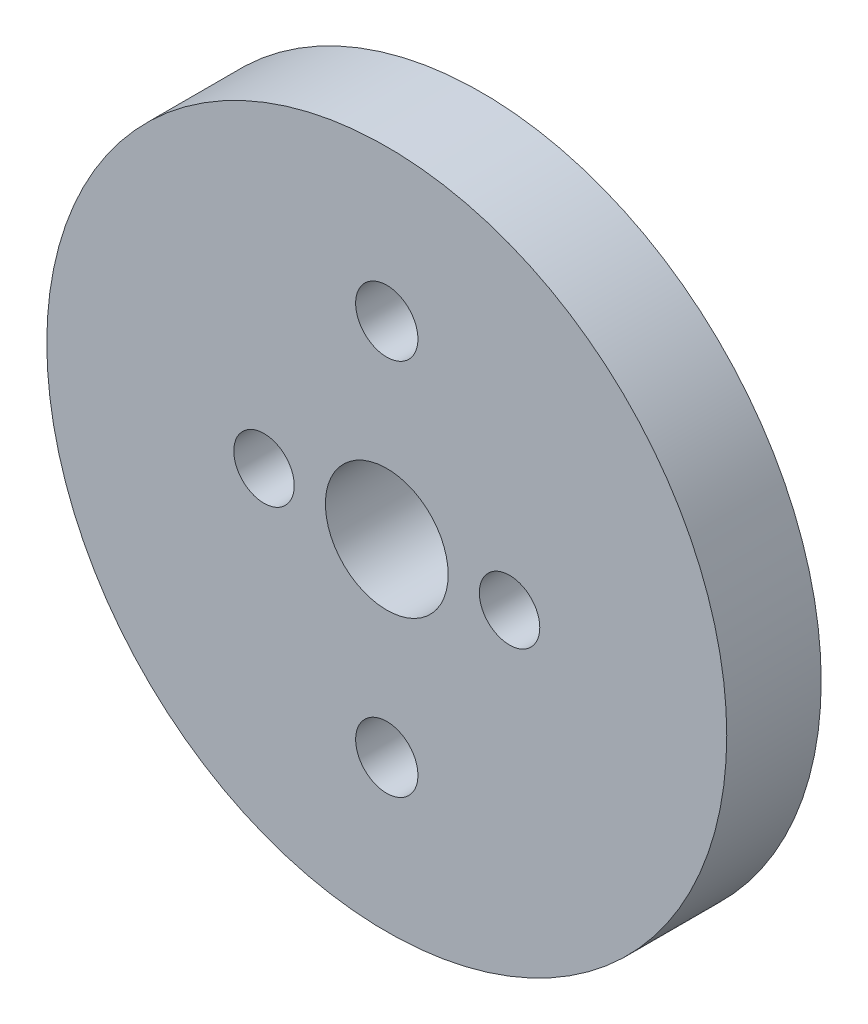
ISO-10303-21;
HEADER;
FILE_DESCRIPTION(('STEP AP214'),'2;1');
FILE_NAME('part.step','',(''),(''),'','','');
FILE_SCHEMA(('AUTOMOTIVE_DESIGN { 1 0 10303 214 1 1 1 1 }'));
ENDSEC;
DATA;
#1=APPLICATION_CONTEXT('core data for automotive mechanical design processes');
#2=APPLICATION_PROTOCOL_DEFINITION('international standard','automotive_design',2000,#1);
#3=PRODUCT_CONTEXT('',#1,'mechanical');
#4=PRODUCT('Part','Part','',(#3));
#5=PRODUCT_RELATED_PRODUCT_CATEGORY('part','',(#4));
#6=PRODUCT_DEFINITION_FORMATION('','',#4);
#7=PRODUCT_DEFINITION_CONTEXT('part definition',#1,'design');
#8=PRODUCT_DEFINITION('design','',#6,#7);
#9=PRODUCT_DEFINITION_SHAPE('','',#8);
#10=(LENGTH_UNIT() NAMED_UNIT(*) SI_UNIT(.MILLI.,.METRE.));
#11=(NAMED_UNIT(*) PLANE_ANGLE_UNIT() SI_UNIT($,.RADIAN.));
#12=(NAMED_UNIT(*) SI_UNIT($,.STERADIAN.) SOLID_ANGLE_UNIT());
#13=UNCERTAINTY_MEASURE_WITH_UNIT(LENGTH_MEASURE(1.E-05),#10,'distance_accuracy_value','');
#14=(GEOMETRIC_REPRESENTATION_CONTEXT(3) GLOBAL_UNCERTAINTY_ASSIGNED_CONTEXT((#13)) GLOBAL_UNIT_ASSIGNED_CONTEXT((#10,
#11,#12)) REPRESENTATION_CONTEXT('',''));
#15=CARTESIAN_POINT('',(0.,0.,0.));
#16=DIRECTION('',(0.,0.,1.));
#17=DIRECTION('',(1.,0.,0.));
#18=AXIS2_PLACEMENT_3D('',#15,#16,#17);
#19=CARTESIAN_POINT('',(0.,0.,5.));
#20=DIRECTION('',(0.,0.,1.));
#21=DIRECTION('',(1.,0.,0.));
#22=AXIS2_PLACEMENT_3D('',#19,#20,#21);
#23=PLANE('',#22);
#24=CARTESIAN_POINT('',(0.,10.,5.));
#25=DIRECTION('',(0.,0.,1.));
#26=DIRECTION('',(1.,0.,0.));
#27=AXIS2_PLACEMENT_3D('',#24,#25,#26);
#28=CIRCLE('',#27,1.65);
#29=CARTESIAN_POINT('',(1.65,10.,5.));
#30=VERTEX_POINT('',#29);
#31=EDGE_CURVE('E72',#30,#30,#28,.T.);
#32=ORIENTED_EDGE('',*,*,#31,.F.);
#33=EDGE_LOOP('',(#32));
#34=FACE_BOUND('',#33,.T.);
#35=CARTESIAN_POINT('',(0.,-10.,5.));
#36=DIRECTION('',(0.,0.,1.));
#37=DIRECTION('',(-1.,0.,0.));
#38=AXIS2_PLACEMENT_3D('',#35,#36,#37);
#39=CIRCLE('',#38,1.65);
#40=CARTESIAN_POINT('',(-1.65,-10.,5.));
#41=VERTEX_POINT('',#40);
#42=EDGE_CURVE('E66',#41,#41,#39,.T.);
#43=ORIENTED_EDGE('',*,*,#42,.F.);
#44=EDGE_LOOP('',(#43));
#45=FACE_BOUND('',#44,.T.);
#46=CARTESIAN_POINT('',(6.5,0.,5.));
#47=DIRECTION('',(0.,0.,1.));
#48=DIRECTION('',(1.,0.,0.));
#49=AXIS2_PLACEMENT_3D('',#46,#47,#48);
#50=CIRCLE('',#49,1.6);
#51=CARTESIAN_POINT('',(8.1,0.,5.));
#52=VERTEX_POINT('',#51);
#53=EDGE_CURVE('E51',#52,#52,#50,.T.);
#54=ORIENTED_EDGE('',*,*,#53,.F.);
#55=EDGE_LOOP('',(#54));
#56=FACE_BOUND('',#55,.T.);
#57=CARTESIAN_POINT('',(0.,0.,5.));
#58=DIRECTION('',(0.,0.,1.));
#59=DIRECTION('',(1.,0.,0.));
#60=AXIS2_PLACEMENT_3D('',#57,#58,#59);
#61=CIRCLE('',#60,18.);
#62=CARTESIAN_POINT('',(18.,0.,5.));
#63=VERTEX_POINT('',#62);
#64=EDGE_CURVE('E10',#63,#63,#61,.T.);
#65=ORIENTED_EDGE('',*,*,#64,.T.);
#66=EDGE_LOOP('',(#65));
#67=FACE_BOUND('',#66,.T.);
#68=CARTESIAN_POINT('',(0.,0.,5.));
#69=DIRECTION('',(0.,0.,1.));
#70=DIRECTION('',(1.,0.,0.));
#71=AXIS2_PLACEMENT_3D('',#68,#69,#70);
#72=CIRCLE('',#71,3.25);
#73=CARTESIAN_POINT('',(3.25,0.,5.));
#74=VERTEX_POINT('',#73);
#75=EDGE_CURVE('E46',#74,#74,#72,.T.);
#76=ORIENTED_EDGE('',*,*,#75,.F.);
#77=EDGE_LOOP('',(#76));
#78=FACE_BOUND('',#77,.T.);
#79=CARTESIAN_POINT('',(-6.5,0.,5.));
#80=DIRECTION('',(0.,0.,1.));
#81=DIRECTION('',(-1.,0.,0.));
#82=AXIS2_PLACEMENT_3D('',#79,#80,#81);
#83=CIRCLE('',#82,1.6);
#84=CARTESIAN_POINT('',(-8.1,0.,5.));
#85=VERTEX_POINT('',#84);
#86=EDGE_CURVE('E57',#85,#85,#83,.T.);
#87=ORIENTED_EDGE('',*,*,#86,.F.);
#88=EDGE_LOOP('',(#87));
#89=FACE_BOUND('',#88,.T.);
#90=ADVANCED_FACE('F35',(#34,#45,#56,#67,#78,#89),#23,.T.);
#91=CARTESIAN_POINT('',(0.,0.,0.));
#92=DIRECTION('',(0.,0.,1.));
#93=DIRECTION('',(1.,0.,0.));
#94=AXIS2_PLACEMENT_3D('',#91,#92,#93);
#95=PLANE('',#94);
#96=CARTESIAN_POINT('',(0.,10.,0.));
#97=DIRECTION('',(0.,0.,1.));
#98=DIRECTION('',(1.,0.,0.));
#99=AXIS2_PLACEMENT_3D('',#96,#97,#98);
#100=CIRCLE('',#99,1.65);
#101=CARTESIAN_POINT('',(1.65,10.,0.));
#102=VERTEX_POINT('',#101);
#103=EDGE_CURVE('E63',#102,#102,#100,.T.);
#104=ORIENTED_EDGE('',*,*,#103,.T.);
#105=EDGE_LOOP('',(#104));
#106=FACE_BOUND('',#105,.T.);
#107=CARTESIAN_POINT('',(0.,-10.,0.));
#108=DIRECTION('',(0.,0.,1.));
#109=DIRECTION('',(-1.,0.,0.));
#110=AXIS2_PLACEMENT_3D('',#107,#108,#109);
#111=CIRCLE('',#110,1.65);
#112=CARTESIAN_POINT('',(-1.65,-10.,0.));
#113=VERTEX_POINT('',#112);
#114=EDGE_CURVE('E69',#113,#113,#111,.T.);
#115=ORIENTED_EDGE('',*,*,#114,.T.);
#116=EDGE_LOOP('',(#115));
#117=FACE_BOUND('',#116,.T.);
#118=CARTESIAN_POINT('',(0.,0.,0.));
#119=DIRECTION('',(0.,0.,1.));
#120=DIRECTION('',(1.,0.,0.));
#121=AXIS2_PLACEMENT_3D('',#118,#119,#120);
#122=CIRCLE('',#121,18.);
#123=CARTESIAN_POINT('',(18.,0.,0.));
#124=VERTEX_POINT('',#123);
#125=EDGE_CURVE('E39',#124,#124,#122,.T.);
#126=ORIENTED_EDGE('',*,*,#125,.F.);
#127=EDGE_LOOP('',(#126));
#128=FACE_BOUND('',#127,.T.);
#129=CARTESIAN_POINT('',(0.,0.,0.));
#130=DIRECTION('',(0.,0.,1.));
#131=DIRECTION('',(1.,0.,0.));
#132=AXIS2_PLACEMENT_3D('',#129,#130,#131);
#133=CIRCLE('',#132,3.25);
#134=CARTESIAN_POINT('',(3.25,0.,0.));
#135=VERTEX_POINT('',#134);
#136=EDGE_CURVE('E48',#135,#135,#133,.T.);
#137=ORIENTED_EDGE('',*,*,#136,.T.);
#138=EDGE_LOOP('',(#137));
#139=FACE_BOUND('',#138,.T.);
#140=CARTESIAN_POINT('',(6.5,0.,0.));
#141=DIRECTION('',(0.,0.,1.));
#142=DIRECTION('',(1.,0.,0.));
#143=AXIS2_PLACEMENT_3D('',#140,#141,#142);
#144=CIRCLE('',#143,1.6);
#145=CARTESIAN_POINT('',(8.1,0.,0.));
#146=VERTEX_POINT('',#145);
#147=EDGE_CURVE('E54',#146,#146,#144,.T.);
#148=ORIENTED_EDGE('',*,*,#147,.T.);
#149=EDGE_LOOP('',(#148));
#150=FACE_BOUND('',#149,.T.);
#151=CARTESIAN_POINT('',(-6.5,0.,0.));
#152=DIRECTION('',(0.,0.,1.));
#153=DIRECTION('',(-1.,0.,0.));
#154=AXIS2_PLACEMENT_3D('',#151,#152,#153);
#155=CIRCLE('',#154,1.6);
#156=CARTESIAN_POINT('',(-8.1,0.,0.));
#157=VERTEX_POINT('',#156);
#158=EDGE_CURVE('E60',#157,#157,#155,.T.);
#159=ORIENTED_EDGE('',*,*,#158,.T.);
#160=EDGE_LOOP('',(#159));
#161=FACE_BOUND('',#160,.T.);
#162=ADVANCED_FACE('F78',(#106,#117,#128,#139,#150,#161),#95,.F.);
#163=CARTESIAN_POINT('',(0.,0.,5.));
#164=DIRECTION('',(0.,0.,-1.));
#165=DIRECTION('',(-1.,0.,0.));
#166=AXIS2_PLACEMENT_3D('',#163,#164,#165);
#167=CYLINDRICAL_SURFACE('',#166,18.);
#168=ORIENTED_EDGE('',*,*,#64,.F.);
#169=EDGE_LOOP('',(#168));
#170=FACE_BOUND('',#169,.T.);
#171=ORIENTED_EDGE('',*,*,#125,.T.);
#172=EDGE_LOOP('',(#171));
#173=FACE_BOUND('',#172,.T.);
#174=ADVANCED_FACE('F37',(#170,#173),#167,.T.);
#175=CARTESIAN_POINT('',(0.,0.,5.));
#176=DIRECTION('',(0.,0.,-1.));
#177=DIRECTION('',(-1.,0.,0.));
#178=AXIS2_PLACEMENT_3D('',#175,#176,#177);
#179=CYLINDRICAL_SURFACE('',#178,3.25);
#180=ORIENTED_EDGE('',*,*,#75,.T.);
#181=EDGE_LOOP('',(#180));
#182=FACE_BOUND('',#181,.T.);
#183=ORIENTED_EDGE('',*,*,#136,.F.);
#184=EDGE_LOOP('',(#183));
#185=FACE_BOUND('',#184,.T.);
#186=ADVANCED_FACE('F110',(#182,#185),#179,.F.);
#187=CARTESIAN_POINT('',(6.5,0.,5.));
#188=DIRECTION('',(0.,0.,-1.));
#189=DIRECTION('',(-1.,0.,0.));
#190=AXIS2_PLACEMENT_3D('',#187,#188,#189);
#191=CYLINDRICAL_SURFACE('',#190,1.6);
#192=ORIENTED_EDGE('',*,*,#53,.T.);
#193=EDGE_LOOP('',(#192));
#194=FACE_BOUND('',#193,.T.);
#195=ORIENTED_EDGE('',*,*,#147,.F.);
#196=EDGE_LOOP('',(#195));
#197=FACE_BOUND('',#196,.T.);
#198=ADVANCED_FACE('F102',(#194,#197),#191,.F.);
#199=CARTESIAN_POINT('',(-6.5,0.,5.));
#200=DIRECTION('',(0.,0.,-1.));
#201=DIRECTION('',(-1.,0.,0.));
#202=AXIS2_PLACEMENT_3D('',#199,#200,#201);
#203=CYLINDRICAL_SURFACE('',#202,1.6);
#204=ORIENTED_EDGE('',*,*,#86,.T.);
#205=EDGE_LOOP('',(#204));
#206=FACE_BOUND('',#205,.T.);
#207=ORIENTED_EDGE('',*,*,#158,.F.);
#208=EDGE_LOOP('',(#207));
#209=FACE_BOUND('',#208,.T.);
#210=ADVANCED_FACE('F99',(#206,#209),#203,.F.);
#211=CARTESIAN_POINT('',(0.,-10.,0.));
#212=DIRECTION('',(0.,0.,1.));
#213=DIRECTION('',(1.,0.,0.));
#214=AXIS2_PLACEMENT_3D('',#211,#212,#213);
#215=CYLINDRICAL_SURFACE('',#214,1.65);
#216=ORIENTED_EDGE('',*,*,#114,.F.);
#217=EDGE_LOOP('',(#216));
#218=FACE_BOUND('',#217,.T.);
#219=ORIENTED_EDGE('',*,*,#42,.T.);
#220=EDGE_LOOP('',(#219));
#221=FACE_BOUND('',#220,.T.);
#222=ADVANCED_FACE('F84',(#218,#221),#215,.F.);
#223=CARTESIAN_POINT('',(0.,10.,0.));
#224=DIRECTION('',(0.,0.,1.));
#225=DIRECTION('',(1.,0.,0.));
#226=AXIS2_PLACEMENT_3D('',#223,#224,#225);
#227=CYLINDRICAL_SURFACE('',#226,1.65);
#228=ORIENTED_EDGE('',*,*,#103,.F.);
#229=EDGE_LOOP('',(#228));
#230=FACE_BOUND('',#229,.T.);
#231=ORIENTED_EDGE('',*,*,#31,.T.);
#232=EDGE_LOOP('',(#231));
#233=FACE_BOUND('',#232,.T.);
#234=ADVANCED_FACE('F81',(#230,#233),#227,.F.);
#235=CLOSED_SHELL('',(#90,#162,#174,#186,#198,#210,#222,#234));
#236=MANIFOLD_SOLID_BREP('B2',#235);
#237=ADVANCED_BREP_SHAPE_REPRESENTATION('',(#18,#236),#14);
#238=SHAPE_DEFINITION_REPRESENTATION(#9,#237);
ENDSEC;
END-ISO-10303-21;
